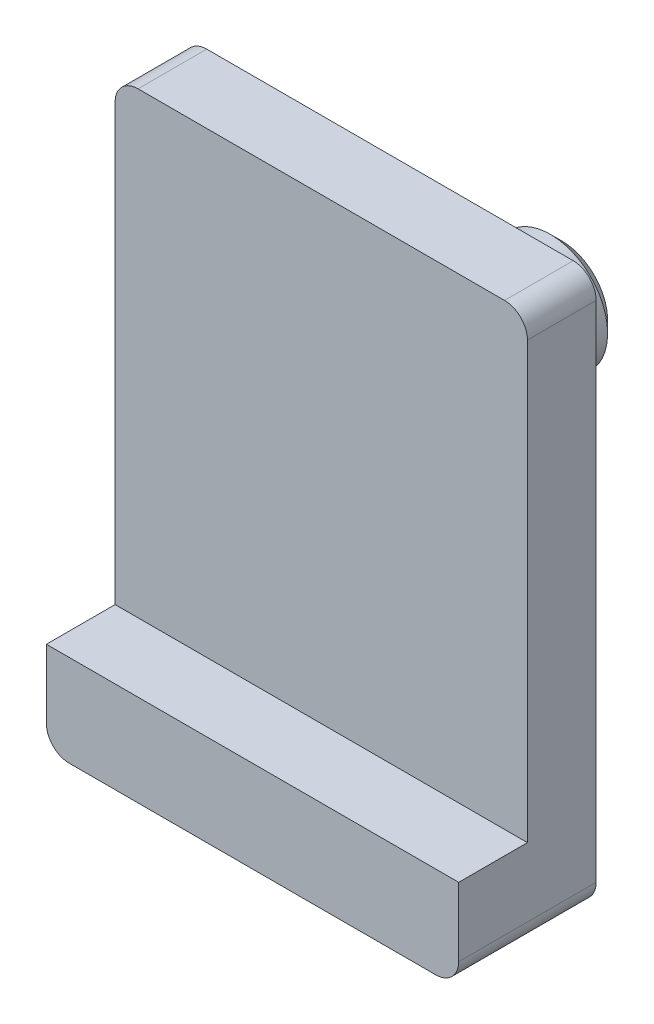
ISO-10303-21;
HEADER;
FILE_DESCRIPTION(('STEP AP214'),'2;1');
FILE_NAME('part.step','',(''),(''),'','','');
FILE_SCHEMA(('AUTOMOTIVE_DESIGN { 1 0 10303 214 1 1 1 1 }'));
ENDSEC;
DATA;
#1=APPLICATION_CONTEXT('core data for automotive mechanical design processes');
#2=APPLICATION_PROTOCOL_DEFINITION('international standard','automotive_design',2000,#1);
#3=PRODUCT_CONTEXT('',#1,'mechanical');
#4=PRODUCT('Part','Part','',(#3));
#5=PRODUCT_RELATED_PRODUCT_CATEGORY('part','',(#4));
#6=PRODUCT_DEFINITION_FORMATION('','',#4);
#7=PRODUCT_DEFINITION_CONTEXT('part definition',#1,'design');
#8=PRODUCT_DEFINITION('design','',#6,#7);
#9=PRODUCT_DEFINITION_SHAPE('','',#8);
#10=(LENGTH_UNIT() NAMED_UNIT(*) SI_UNIT(.MILLI.,.METRE.));
#11=(NAMED_UNIT(*) PLANE_ANGLE_UNIT() SI_UNIT($,.RADIAN.));
#12=(NAMED_UNIT(*) SI_UNIT($,.STERADIAN.) SOLID_ANGLE_UNIT());
#13=UNCERTAINTY_MEASURE_WITH_UNIT(LENGTH_MEASURE(1.E-05),#10,'distance_accuracy_value','');
#14=(GEOMETRIC_REPRESENTATION_CONTEXT(3) GLOBAL_UNCERTAINTY_ASSIGNED_CONTEXT((#13)) GLOBAL_UNIT_ASSIGNED_CONTEXT((#10,
#11,#12)) REPRESENTATION_CONTEXT('',''));
#15=CARTESIAN_POINT('',(0.,0.,0.));
#16=DIRECTION('',(0.,0.,1.));
#17=DIRECTION('',(1.,0.,0.));
#18=AXIS2_PLACEMENT_3D('',#15,#16,#17);
#19=CARTESIAN_POINT('',(1.,1.,3.));
#20=DIRECTION('',(0.,0.,-1.));
#21=DIRECTION('',(-1.,0.,0.));
#22=AXIS2_PLACEMENT_3D('',#19,#20,#21);
#23=PLANE('',#22);
#24=DIRECTION('',(-1.,0.,0.));
#25=VECTOR('',#24,1.);
#26=CARTESIAN_POINT('',(0.,4.,3.));
#27=LINE('',#26,#25);
#28=CARTESIAN_POINT('',(18.,4.,3.));
#29=VERTEX_POINT('',#28);
#30=CARTESIAN_POINT('',(0.,4.,3.));
#31=VERTEX_POINT('',#30);
#32=EDGE_CURVE('E48',#29,#31,#27,.T.);
#33=ORIENTED_EDGE('',*,*,#32,.F.);
#34=DIRECTION('',(0.,1.,0.));
#35=VECTOR('',#34,1.);
#36=CARTESIAN_POINT('',(18.,1.00000000000001,3.));
#37=LINE('',#36,#35);
#38=CARTESIAN_POINT('',(18.,23.,3.));
#39=VERTEX_POINT('',#38);
#40=EDGE_CURVE('E93',#29,#39,#37,.T.);
#41=ORIENTED_EDGE('',*,*,#40,.T.);
#42=CARTESIAN_POINT('',(17.,23.,3.));
#43=DIRECTION('',(0.,0.,1.));
#44=DIRECTION('',(-1.,0.,0.));
#45=AXIS2_PLACEMENT_3D('',#42,#43,#44);
#46=CIRCLE('',#45,1.);
#47=CARTESIAN_POINT('',(17.,24.,3.));
#48=VERTEX_POINT('',#47);
#49=EDGE_CURVE('E148',#39,#48,#46,.T.);
#50=ORIENTED_EDGE('',*,*,#49,.T.);
#51=DIRECTION('',(-1.,0.,0.));
#52=VECTOR('',#51,1.);
#53=CARTESIAN_POINT('',(1.00000000000001,24.,3.));
#54=LINE('',#53,#52);
#55=CARTESIAN_POINT('',(1.00000000000001,24.,3.));
#56=VERTEX_POINT('',#55);
#57=EDGE_CURVE('E150',#48,#56,#54,.T.);
#58=ORIENTED_EDGE('',*,*,#57,.T.);
#59=CARTESIAN_POINT('',(1.,23.,3.));
#60=DIRECTION('',(0.,0.,1.));
#61=DIRECTION('',(-1.,0.,0.));
#62=AXIS2_PLACEMENT_3D('',#59,#60,#61);
#63=CIRCLE('',#62,1.);
#64=CARTESIAN_POINT('',(0.,23.,3.));
#65=VERTEX_POINT('',#64);
#66=EDGE_CURVE('E55',#56,#65,#63,.T.);
#67=ORIENTED_EDGE('',*,*,#66,.T.);
#68=DIRECTION('',(0.,-1.,0.));
#69=VECTOR('',#68,1.);
#70=CARTESIAN_POINT('',(0.,1.00000000000001,3.));
#71=LINE('',#70,#69);
#72=EDGE_CURVE('E153',#65,#31,#71,.T.);
#73=ORIENTED_EDGE('',*,*,#72,.T.);
#74=EDGE_LOOP('',(#33,#41,#50,#58,#67,#73));
#75=FACE_BOUND('',#74,.T.);
#76=ADVANCED_FACE('F33',(#75),#23,.F.);
#77=CARTESIAN_POINT('',(1.,1.,3.));
#78=DIRECTION('',(0.,0.,-1.));
#79=DIRECTION('',(-1.,0.,0.));
#80=AXIS2_PLACEMENT_3D('',#77,#78,#79);
#81=CYLINDRICAL_SURFACE('',#80,1.);
#82=CARTESIAN_POINT('',(1.,1.,0.));
#83=DIRECTION('',(0.,0.,1.));
#84=DIRECTION('',(-1.,0.,0.));
#85=AXIS2_PLACEMENT_3D('',#82,#83,#84);
#86=CIRCLE('',#85,1.);
#87=CARTESIAN_POINT('',(0.,1.00000000000001,0.));
#88=VERTEX_POINT('',#87);
#89=CARTESIAN_POINT('',(1.00000000000001,0.,0.));
#90=VERTEX_POINT('',#89);
#91=EDGE_CURVE('E139',#88,#90,#86,.T.);
#92=ORIENTED_EDGE('',*,*,#91,.T.);
#93=DIRECTION('',(0.,0.,-1.));
#94=VECTOR('',#93,1.);
#95=CARTESIAN_POINT('',(1.00000000000001,0.,3.));
#96=LINE('',#95,#94);
#97=CARTESIAN_POINT('',(1.00000000000001,0.,6.));
#98=VERTEX_POINT('',#97);
#99=EDGE_CURVE('E185',#98,#90,#96,.T.);
#100=ORIENTED_EDGE('',*,*,#99,.F.);
#101=CARTESIAN_POINT('',(1.,1.,6.));
#102=DIRECTION('',(0.,0.,1.));
#103=DIRECTION('',(-1.,0.,0.));
#104=AXIS2_PLACEMENT_3D('',#101,#102,#103);
#105=CIRCLE('',#104,1.);
#106=CARTESIAN_POINT('',(0.,1.00000000000001,6.));
#107=VERTEX_POINT('',#106);
#108=EDGE_CURVE('E269',#107,#98,#105,.T.);
#109=ORIENTED_EDGE('',*,*,#108,.F.);
#110=DIRECTION('',(0.,0.,-1.));
#111=VECTOR('',#110,1.);
#112=CARTESIAN_POINT('',(0.,1.00000000000001,3.));
#113=LINE('',#112,#111);
#114=EDGE_CURVE('E154',#107,#88,#113,.T.);
#115=ORIENTED_EDGE('',*,*,#114,.T.);
#116=EDGE_LOOP('',(#92,#100,#109,#115));
#117=FACE_BOUND('',#116,.T.);
#118=ADVANCED_FACE('F208',(#117),#81,.T.);
#119=CARTESIAN_POINT('',(1.00000000000001,0.,3.));
#120=DIRECTION('',(0.,1.,0.));
#121=DIRECTION('',(0.,0.,1.));
#122=AXIS2_PLACEMENT_3D('',#119,#120,#121);
#123=PLANE('',#122);
#124=DIRECTION('',(1.,0.,0.));
#125=VECTOR('',#124,1.);
#126=CARTESIAN_POINT('',(1.00000000000001,0.,0.));
#127=LINE('',#126,#125);
#128=CARTESIAN_POINT('',(17.,0.,0.));
#129=VERTEX_POINT('',#128);
#130=EDGE_CURVE('E142',#90,#129,#127,.T.);
#131=ORIENTED_EDGE('',*,*,#130,.T.);
#132=DIRECTION('',(0.,0.,-1.));
#133=VECTOR('',#132,1.);
#134=CARTESIAN_POINT('',(17.,0.,3.));
#135=LINE('',#134,#133);
#136=CARTESIAN_POINT('',(17.,0.,6.));
#137=VERTEX_POINT('',#136);
#138=EDGE_CURVE('E182',#137,#129,#135,.T.);
#139=ORIENTED_EDGE('',*,*,#138,.F.);
#140=DIRECTION('',(1.,0.,0.));
#141=VECTOR('',#140,1.);
#142=CARTESIAN_POINT('',(1.00000000000001,0.,6.));
#143=LINE('',#142,#141);
#144=EDGE_CURVE('E267',#98,#137,#143,.T.);
#145=ORIENTED_EDGE('',*,*,#144,.F.);
#146=ORIENTED_EDGE('',*,*,#99,.T.);
#147=EDGE_LOOP('',(#131,#139,#145,#146));
#148=FACE_BOUND('',#147,.T.);
#149=ADVANCED_FACE('F213',(#148),#123,.F.);
#150=CARTESIAN_POINT('',(17.,1.,3.));
#151=DIRECTION('',(0.,0.,-1.));
#152=DIRECTION('',(-1.,0.,0.));
#153=AXIS2_PLACEMENT_3D('',#150,#151,#152);
#154=CYLINDRICAL_SURFACE('',#153,1.);
#155=CARTESIAN_POINT('',(17.,1.,0.));
#156=DIRECTION('',(0.,0.,1.));
#157=DIRECTION('',(1.,0.,0.));
#158=AXIS2_PLACEMENT_3D('',#155,#156,#157);
#159=CIRCLE('',#158,1.);
#160=CARTESIAN_POINT('',(18.,1.,0.));
#161=VERTEX_POINT('',#160);
#162=EDGE_CURVE('E157',#129,#161,#159,.T.);
#163=ORIENTED_EDGE('',*,*,#162,.T.);
#164=DIRECTION('',(0.,0.,-1.));
#165=VECTOR('',#164,1.);
#166=CARTESIAN_POINT('',(18.,1.,3.));
#167=LINE('',#166,#165);
#168=CARTESIAN_POINT('',(18.,1.,6.));
#169=VERTEX_POINT('',#168);
#170=EDGE_CURVE('E180',#169,#161,#167,.T.);
#171=ORIENTED_EDGE('',*,*,#170,.F.);
#172=CARTESIAN_POINT('',(17.,1.,6.));
#173=DIRECTION('',(0.,0.,1.));
#174=DIRECTION('',(1.,0.,0.));
#175=AXIS2_PLACEMENT_3D('',#172,#173,#174);
#176=CIRCLE('',#175,1.);
#177=EDGE_CURVE('E134',#137,#169,#176,.T.);
#178=ORIENTED_EDGE('',*,*,#177,.F.);
#179=ORIENTED_EDGE('',*,*,#138,.T.);
#180=EDGE_LOOP('',(#163,#171,#178,#179));
#181=FACE_BOUND('',#180,.T.);
#182=ADVANCED_FACE('F240',(#181),#154,.T.);
#183=CARTESIAN_POINT('',(18.,1.00000000000001,3.));
#184=DIRECTION('',(-1.,0.,0.));
#185=DIRECTION('',(0.,0.,1.));
#186=AXIS2_PLACEMENT_3D('',#183,#184,#185);
#187=PLANE('',#186);
#188=DIRECTION('',(0.,1.,0.));
#189=VECTOR('',#188,1.);
#190=CARTESIAN_POINT('',(18.,1.00000000000001,0.));
#191=LINE('',#190,#189);
#192=CARTESIAN_POINT('',(18.,23.,0.));
#193=VERTEX_POINT('',#192);
#194=EDGE_CURVE('E159',#161,#193,#191,.T.);
#195=ORIENTED_EDGE('',*,*,#194,.T.);
#196=DIRECTION('',(0.,0.,-1.));
#197=VECTOR('',#196,1.);
#198=CARTESIAN_POINT('',(18.,23.,3.));
#199=LINE('',#198,#197);
#200=EDGE_CURVE('E177',#39,#193,#199,.T.);
#201=ORIENTED_EDGE('',*,*,#200,.F.);
#202=ORIENTED_EDGE('',*,*,#40,.F.);
#203=DIRECTION('',(0.,0.,-1.));
#204=VECTOR('',#203,1.);
#205=CARTESIAN_POINT('',(18.,4.,6.));
#206=LINE('',#205,#204);
#207=CARTESIAN_POINT('',(18.,4.,6.));
#208=VERTEX_POINT('',#207);
#209=EDGE_CURVE('E120',#208,#29,#206,.T.);
#210=ORIENTED_EDGE('',*,*,#209,.F.);
#211=DIRECTION('',(0.,1.,0.));
#212=VECTOR('',#211,1.);
#213=CARTESIAN_POINT('',(18.,1.00000000000001,6.));
#214=LINE('',#213,#212);
#215=EDGE_CURVE('E127',#169,#208,#214,.T.);
#216=ORIENTED_EDGE('',*,*,#215,.F.);
#217=ORIENTED_EDGE('',*,*,#170,.T.);
#218=EDGE_LOOP('',(#195,#201,#202,#210,#216,#217));
#219=FACE_BOUND('',#218,.T.);
#220=ADVANCED_FACE('F138',(#219),#187,.F.);
#221=CARTESIAN_POINT('',(17.,23.,3.));
#222=DIRECTION('',(0.,0.,-1.));
#223=DIRECTION('',(-1.,0.,0.));
#224=AXIS2_PLACEMENT_3D('',#221,#222,#223);
#225=CYLINDRICAL_SURFACE('',#224,1.);
#226=CARTESIAN_POINT('',(17.,23.,0.));
#227=DIRECTION('',(0.,0.,1.));
#228=DIRECTION('',(-1.,0.,0.));
#229=AXIS2_PLACEMENT_3D('',#226,#227,#228);
#230=CIRCLE('',#229,1.);
#231=CARTESIAN_POINT('',(17.,24.,0.));
#232=VERTEX_POINT('',#231);
#233=EDGE_CURVE('E161',#193,#232,#230,.T.);
#234=ORIENTED_EDGE('',*,*,#233,.T.);
#235=DIRECTION('',(0.,0.,-1.));
#236=VECTOR('',#235,1.);
#237=CARTESIAN_POINT('',(17.,24.,3.));
#238=LINE('',#237,#236);
#239=EDGE_CURVE('E174',#48,#232,#238,.T.);
#240=ORIENTED_EDGE('',*,*,#239,.F.);
#241=ORIENTED_EDGE('',*,*,#49,.F.);
#242=ORIENTED_EDGE('',*,*,#200,.T.);
#243=EDGE_LOOP('',(#234,#240,#241,#242));
#244=FACE_BOUND('',#243,.T.);
#245=ADVANCED_FACE('F233',(#244),#225,.T.);
#246=CARTESIAN_POINT('',(1.00000000000001,24.,3.));
#247=DIRECTION('',(0.,-1.,0.));
#248=DIRECTION('',(0.,0.,-1.));
#249=AXIS2_PLACEMENT_3D('',#246,#247,#248);
#250=PLANE('',#249);
#251=DIRECTION('',(-1.,0.,0.));
#252=VECTOR('',#251,1.);
#253=CARTESIAN_POINT('',(1.00000000000001,24.,0.));
#254=LINE('',#253,#252);
#255=CARTESIAN_POINT('',(1.00000000000001,24.,0.));
#256=VERTEX_POINT('',#255);
#257=EDGE_CURVE('E163',#232,#256,#254,.T.);
#258=ORIENTED_EDGE('',*,*,#257,.T.);
#259=DIRECTION('',(0.,0.,-1.));
#260=VECTOR('',#259,1.);
#261=CARTESIAN_POINT('',(1.00000000000001,24.,3.));
#262=LINE('',#261,#260);
#263=EDGE_CURVE('E171',#56,#256,#262,.T.);
#264=ORIENTED_EDGE('',*,*,#263,.F.);
#265=ORIENTED_EDGE('',*,*,#57,.F.);
#266=ORIENTED_EDGE('',*,*,#239,.T.);
#267=EDGE_LOOP('',(#258,#264,#265,#266));
#268=FACE_BOUND('',#267,.T.);
#269=ADVANCED_FACE('F229',(#268),#250,.F.);
#270=CARTESIAN_POINT('',(1.,23.,3.));
#271=DIRECTION('',(0.,0.,-1.));
#272=DIRECTION('',(-1.,0.,0.));
#273=AXIS2_PLACEMENT_3D('',#270,#271,#272);
#274=CYLINDRICAL_SURFACE('',#273,1.);
#275=CARTESIAN_POINT('',(1.,23.,0.));
#276=DIRECTION('',(0.,0.,1.));
#277=DIRECTION('',(-1.,0.,0.));
#278=AXIS2_PLACEMENT_3D('',#275,#276,#277);
#279=CIRCLE('',#278,1.);
#280=CARTESIAN_POINT('',(0.,23.,0.));
#281=VERTEX_POINT('',#280);
#282=EDGE_CURVE('E165',#256,#281,#279,.T.);
#283=ORIENTED_EDGE('',*,*,#282,.T.);
#284=DIRECTION('',(0.,0.,-1.));
#285=VECTOR('',#284,1.);
#286=CARTESIAN_POINT('',(0.,23.,3.));
#287=LINE('',#286,#285);
#288=EDGE_CURVE('E169',#65,#281,#287,.T.);
#289=ORIENTED_EDGE('',*,*,#288,.F.);
#290=ORIENTED_EDGE('',*,*,#66,.F.);
#291=ORIENTED_EDGE('',*,*,#263,.T.);
#292=EDGE_LOOP('',(#283,#289,#290,#291));
#293=FACE_BOUND('',#292,.T.);
#294=ADVANCED_FACE('F226',(#293),#274,.T.);
#295=CARTESIAN_POINT('',(0.,1.00000000000001,3.));
#296=DIRECTION('',(1.,0.,0.));
#297=DIRECTION('',(0.,0.,-1.));
#298=AXIS2_PLACEMENT_3D('',#295,#296,#297);
#299=PLANE('',#298);
#300=DIRECTION('',(0.,-1.,0.));
#301=VECTOR('',#300,1.);
#302=CARTESIAN_POINT('',(0.,1.00000000000001,0.));
#303=LINE('',#302,#301);
#304=EDGE_CURVE('E89',#281,#88,#303,.T.);
#305=ORIENTED_EDGE('',*,*,#304,.T.);
#306=ORIENTED_EDGE('',*,*,#114,.F.);
#307=DIRECTION('',(0.,-1.,0.));
#308=VECTOR('',#307,1.);
#309=CARTESIAN_POINT('',(0.,1.00000000000001,6.));
#310=LINE('',#309,#308);
#311=CARTESIAN_POINT('',(0.,4.,6.));
#312=VERTEX_POINT('',#311);
#313=EDGE_CURVE('E126',#312,#107,#310,.T.);
#314=ORIENTED_EDGE('',*,*,#313,.F.);
#315=DIRECTION('',(0.,0.,-1.));
#316=VECTOR('',#315,1.);
#317=CARTESIAN_POINT('',(0.,4.,6.));
#318=LINE('',#317,#316);
#319=EDGE_CURVE('E122',#312,#31,#318,.T.);
#320=ORIENTED_EDGE('',*,*,#319,.T.);
#321=ORIENTED_EDGE('',*,*,#72,.F.);
#322=ORIENTED_EDGE('',*,*,#288,.T.);
#323=EDGE_LOOP('',(#305,#306,#314,#320,#321,#322));
#324=FACE_BOUND('',#323,.T.);
#325=ADVANCED_FACE('F222',(#324),#299,.F.);
#326=CARTESIAN_POINT('',(1.,1.,0.));
#327=DIRECTION('',(0.,0.,-1.));
#328=DIRECTION('',(-1.,0.,0.));
#329=AXIS2_PLACEMENT_3D('',#326,#327,#328);
#330=PLANE('',#329);
#331=CARTESIAN_POINT('',(3.,7.,0.));
#332=DIRECTION('',(0.,0.,-1.));
#333=DIRECTION('',(-1.,0.,0.));
#334=AXIS2_PLACEMENT_3D('',#331,#332,#333);
#335=CIRCLE('',#334,2.5);
#336=CARTESIAN_POINT('',(0.499999999999998,7.,0.));
#337=VERTEX_POINT('',#336);
#338=EDGE_CURVE('E263',#337,#337,#335,.T.);
#339=ORIENTED_EDGE('',*,*,#338,.F.);
#340=EDGE_LOOP('',(#339));
#341=FACE_BOUND('',#340,.T.);
#342=CARTESIAN_POINT('',(15.,21.,0.));
#343=DIRECTION('',(0.,0.,-1.));
#344=DIRECTION('',(-1.,0.,0.));
#345=AXIS2_PLACEMENT_3D('',#342,#343,#344);
#346=CIRCLE('',#345,2.5);
#347=CARTESIAN_POINT('',(12.5,21.,0.));
#348=VERTEX_POINT('',#347);
#349=EDGE_CURVE('E261',#348,#348,#346,.T.);
#350=ORIENTED_EDGE('',*,*,#349,.F.);
#351=EDGE_LOOP('',(#350));
#352=FACE_BOUND('',#351,.T.);
#353=ORIENTED_EDGE('',*,*,#91,.F.);
#354=ORIENTED_EDGE('',*,*,#304,.F.);
#355=ORIENTED_EDGE('',*,*,#282,.F.);
#356=ORIENTED_EDGE('',*,*,#257,.F.);
#357=ORIENTED_EDGE('',*,*,#233,.F.);
#358=ORIENTED_EDGE('',*,*,#194,.F.);
#359=ORIENTED_EDGE('',*,*,#162,.F.);
#360=ORIENTED_EDGE('',*,*,#130,.F.);
#361=EDGE_LOOP('',(#353,#354,#355,#356,#357,#358,#359,#360));
#362=FACE_BOUND('',#361,.T.);
#363=ADVANCED_FACE('F219',(#341,#352,#362),#330,.T.);
#364=CARTESIAN_POINT('',(0.,4.,6.));
#365=DIRECTION('',(0.,-1.,0.));
#366=DIRECTION('',(0.,0.,-1.));
#367=AXIS2_PLACEMENT_3D('',#364,#365,#366);
#368=PLANE('',#367);
#369=ORIENTED_EDGE('',*,*,#32,.T.);
#370=ORIENTED_EDGE('',*,*,#319,.F.);
#371=DIRECTION('',(-1.,0.,0.));
#372=VECTOR('',#371,1.);
#373=CARTESIAN_POINT('',(0.,4.,6.));
#374=LINE('',#373,#372);
#375=EDGE_CURVE('E116',#208,#312,#374,.T.);
#376=ORIENTED_EDGE('',*,*,#375,.F.);
#377=ORIENTED_EDGE('',*,*,#209,.T.);
#378=EDGE_LOOP('',(#369,#370,#376,#377));
#379=FACE_BOUND('',#378,.T.);
#380=ADVANCED_FACE('F118',(#379),#368,.F.);
#381=CARTESIAN_POINT('',(1.,1.,6.));
#382=DIRECTION('',(0.,0.,-1.));
#383=DIRECTION('',(-1.,0.,0.));
#384=AXIS2_PLACEMENT_3D('',#381,#382,#383);
#385=PLANE('',#384);
#386=ORIENTED_EDGE('',*,*,#215,.T.);
#387=ORIENTED_EDGE('',*,*,#375,.T.);
#388=ORIENTED_EDGE('',*,*,#313,.T.);
#389=ORIENTED_EDGE('',*,*,#108,.T.);
#390=ORIENTED_EDGE('',*,*,#144,.T.);
#391=ORIENTED_EDGE('',*,*,#177,.T.);
#392=EDGE_LOOP('',(#386,#387,#388,#389,#390,#391));
#393=FACE_BOUND('',#392,.T.);
#394=ADVANCED_FACE('F131',(#393),#385,.F.);
#395=CARTESIAN_POINT('',(15.,21.,-1.5));
#396=DIRECTION('',(0.,0.,1.));
#397=DIRECTION('',(1.,0.,0.));
#398=AXIS2_PLACEMENT_3D('',#395,#396,#397);
#399=CYLINDRICAL_SURFACE('',#398,2.5);
#400=CARTESIAN_POINT('',(15.,21.,-0.999999999999993));
#401=DIRECTION('',(0.,0.,-1.));
#402=DIRECTION('',(-1.,0.,0.));
#403=AXIS2_PLACEMENT_3D('',#400,#401,#402);
#404=CIRCLE('',#403,2.5);
#405=CARTESIAN_POINT('',(12.5,21.,-0.999999999999993));
#406=VERTEX_POINT('',#405);
#407=EDGE_CURVE('E11',#406,#406,#404,.F.);
#408=ORIENTED_EDGE('',*,*,#407,.T.);
#409=EDGE_LOOP('',(#408));
#410=FACE_BOUND('',#409,.T.);
#411=ORIENTED_EDGE('',*,*,#349,.T.);
#412=EDGE_LOOP('',(#411));
#413=FACE_BOUND('',#412,.T.);
#414=ADVANCED_FACE('F280',(#410,#413),#399,.T.);
#415=CARTESIAN_POINT('',(15.,21.,-1.5));
#416=DIRECTION('',(0.,0.,-1.));
#417=DIRECTION('',(-1.,0.,0.));
#418=AXIS2_PLACEMENT_3D('',#415,#416,#417);
#419=PLANE('',#418);
#420=CARTESIAN_POINT('',(15.,21.,-1.5));
#421=DIRECTION('',(0.,0.,-1.));
#422=DIRECTION('',(-1.,0.,0.));
#423=AXIS2_PLACEMENT_3D('',#420,#421,#422);
#424=CIRCLE('',#423,2.);
#425=CARTESIAN_POINT('',(13.,21.,-1.5));
#426=VERTEX_POINT('',#425);
#427=EDGE_CURVE('E41',#426,#426,#424,.T.);
#428=ORIENTED_EDGE('',*,*,#427,.T.);
#429=EDGE_LOOP('',(#428));
#430=FACE_BOUND('',#429,.T.);
#431=ADVANCED_FACE('F196',(#430),#419,.T.);
#432=CARTESIAN_POINT('',(3.,7.,-1.5));
#433=DIRECTION('',(0.,0.,1.));
#434=DIRECTION('',(1.,0.,0.));
#435=AXIS2_PLACEMENT_3D('',#432,#433,#434);
#436=CYLINDRICAL_SURFACE('',#435,2.5);
#437=CARTESIAN_POINT('',(3.,7.,-1.00000000000001));
#438=DIRECTION('',(0.,0.,-1.));
#439=DIRECTION('',(-1.,0.,0.));
#440=AXIS2_PLACEMENT_3D('',#437,#438,#439);
#441=CIRCLE('',#440,2.5);
#442=CARTESIAN_POINT('',(0.499999999999998,7.,-1.00000000000001));
#443=VERTEX_POINT('',#442);
#444=EDGE_CURVE('E191',#443,#443,#441,.F.);
#445=ORIENTED_EDGE('',*,*,#444,.T.);
#446=EDGE_LOOP('',(#445));
#447=FACE_BOUND('',#446,.T.);
#448=ORIENTED_EDGE('',*,*,#338,.T.);
#449=EDGE_LOOP('',(#448));
#450=FACE_BOUND('',#449,.T.);
#451=ADVANCED_FACE('F276',(#447,#450),#436,.T.);
#452=CARTESIAN_POINT('',(3.,7.,-1.5));
#453=DIRECTION('',(0.,0.,-1.));
#454=DIRECTION('',(-1.,0.,0.));
#455=AXIS2_PLACEMENT_3D('',#452,#453,#454);
#456=PLANE('',#455);
#457=CARTESIAN_POINT('',(3.,7.,-1.5));
#458=DIRECTION('',(0.,0.,-1.));
#459=DIRECTION('',(-1.,0.,0.));
#460=AXIS2_PLACEMENT_3D('',#457,#458,#459);
#461=CIRCLE('',#460,2.00000000000001);
#462=CARTESIAN_POINT('',(0.999999999999988,7.,-1.5));
#463=VERTEX_POINT('',#462);
#464=EDGE_CURVE('E188',#463,#463,#461,.T.);
#465=ORIENTED_EDGE('',*,*,#464,.T.);
#466=EDGE_LOOP('',(#465));
#467=FACE_BOUND('',#466,.T.);
#468=ADVANCED_FACE('F204',(#467),#456,.T.);
#469=CARTESIAN_POINT('',(3.,7.,-1.5));
#470=DIRECTION('',(0.,0.,1.));
#471=DIRECTION('',(1.,0.,0.));
#472=AXIS2_PLACEMENT_3D('',#469,#470,#471);
#473=CONICAL_SURFACE('',#472,2.00000000000001,0.785398163397444);
#474=ORIENTED_EDGE('',*,*,#444,.F.);
#475=EDGE_LOOP('',(#474));
#476=FACE_BOUND('',#475,.T.);
#477=ORIENTED_EDGE('',*,*,#464,.F.);
#478=EDGE_LOOP('',(#477));
#479=FACE_BOUND('',#478,.T.);
#480=ADVANCED_FACE('F199',(#476,#479),#473,.T.);
#481=CARTESIAN_POINT('',(15.,21.,-1.5));
#482=DIRECTION('',(0.,0.,1.));
#483=DIRECTION('',(1.,0.,0.));
#484=AXIS2_PLACEMENT_3D('',#481,#482,#483);
#485=CONICAL_SURFACE('',#484,2.,0.785398163397443);
#486=ORIENTED_EDGE('',*,*,#407,.F.);
#487=EDGE_LOOP('',(#486));
#488=FACE_BOUND('',#487,.T.);
#489=ORIENTED_EDGE('',*,*,#427,.F.);
#490=EDGE_LOOP('',(#489));
#491=FACE_BOUND('',#490,.T.);
#492=ADVANCED_FACE('F35',(#488,#491),#485,.T.);
#493=CLOSED_SHELL('',(#76,#118,#149,#182,#220,#245,#269,#294,#325,#363,#380,#394,#414,#431,#451,
#468,#480,#492));
#494=MANIFOLD_SOLID_BREP('B2',#493);
#495=ADVANCED_BREP_SHAPE_REPRESENTATION('',(#18,#494),#14);
#496=SHAPE_DEFINITION_REPRESENTATION(#9,#495);
ENDSEC;
END-ISO-10303-21;
